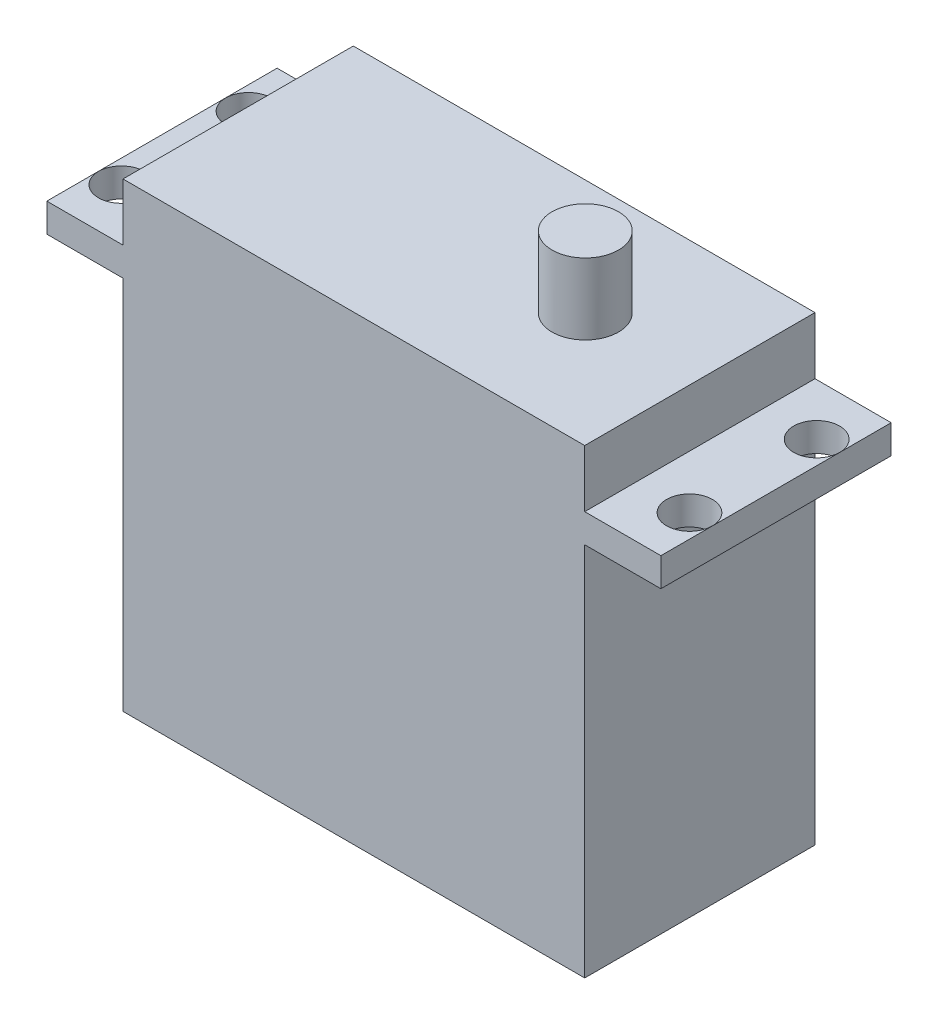
ISO-10303-21;
HEADER;
FILE_DESCRIPTION(('STEP AP214'),'2;1');
FILE_NAME('part.step','',(''),(''),'','','');
FILE_SCHEMA(('AUTOMOTIVE_DESIGN { 1 0 10303 214 1 1 1 1 }'));
ENDSEC;
DATA;
#1=APPLICATION_CONTEXT('core data for automotive mechanical design processes');
#2=APPLICATION_PROTOCOL_DEFINITION('international standard','automotive_design',2000,#1);
#3=PRODUCT_CONTEXT('',#1,'mechanical');
#4=PRODUCT('Part','Part','',(#3));
#5=PRODUCT_RELATED_PRODUCT_CATEGORY('part','',(#4));
#6=PRODUCT_DEFINITION_FORMATION('','',#4);
#7=PRODUCT_DEFINITION_CONTEXT('part definition',#1,'design');
#8=PRODUCT_DEFINITION('design','',#6,#7);
#9=PRODUCT_DEFINITION_SHAPE('','',#8);
#10=(LENGTH_UNIT() NAMED_UNIT(*) SI_UNIT(.MILLI.,.METRE.));
#11=(NAMED_UNIT(*) PLANE_ANGLE_UNIT() SI_UNIT($,.RADIAN.));
#12=(NAMED_UNIT(*) SI_UNIT($,.STERADIAN.) SOLID_ANGLE_UNIT());
#13=UNCERTAINTY_MEASURE_WITH_UNIT(LENGTH_MEASURE(1.E-05),#10,'distance_accuracy_value','');
#14=(GEOMETRIC_REPRESENTATION_CONTEXT(3) GLOBAL_UNCERTAINTY_ASSIGNED_CONTEXT((#13)) GLOBAL_UNIT_ASSIGNED_CONTEXT((#10,
#11,#12)) REPRESENTATION_CONTEXT('',''));
#15=CARTESIAN_POINT('',(0.,0.,0.));
#16=DIRECTION('',(0.,0.,1.));
#17=DIRECTION('',(1.,0.,0.));
#18=AXIS2_PLACEMENT_3D('',#15,#16,#17);
#19=CARTESIAN_POINT('',(20.15,40.25,10.05));
#20=DIRECTION('',(-1.,0.,0.));
#21=DIRECTION('',(0.,0.,1.));
#22=AXIS2_PLACEMENT_3D('',#19,#20,#21);
#23=PLANE('',#22);
#24=DIRECTION('',(0.,0.,-1.));
#25=VECTOR('',#24,1.);
#26=CARTESIAN_POINT('',(20.15,32.75,0.));
#27=LINE('',#26,#25);
#28=CARTESIAN_POINT('',(20.15,32.75,10.05));
#29=VERTEX_POINT('',#28);
#30=CARTESIAN_POINT('',(20.15,32.75,-10.05));
#31=VERTEX_POINT('',#30);
#32=EDGE_CURVE('E58',#29,#31,#27,.T.);
#33=ORIENTED_EDGE('',*,*,#32,.F.);
#34=DIRECTION('',(0.,-1.,0.));
#35=VECTOR('',#34,1.);
#36=CARTESIAN_POINT('',(20.15,40.25,10.05));
#37=LINE('',#36,#35);
#38=CARTESIAN_POINT('',(20.15,0.,10.05));
#39=VERTEX_POINT('',#38);
#40=EDGE_CURVE('E233',#29,#39,#37,.T.);
#41=ORIENTED_EDGE('',*,*,#40,.T.);
#42=DIRECTION('',(0.,0.,-1.));
#43=VECTOR('',#42,1.);
#44=CARTESIAN_POINT('',(20.15,0.,10.05));
#45=LINE('',#44,#43);
#46=CARTESIAN_POINT('',(20.15,0.,-10.05));
#47=VERTEX_POINT('',#46);
#48=EDGE_CURVE('E222',#39,#47,#45,.T.);
#49=ORIENTED_EDGE('',*,*,#48,.T.);
#50=DIRECTION('',(0.,-1.,0.));
#51=VECTOR('',#50,1.);
#52=CARTESIAN_POINT('',(20.15,40.25,-10.05));
#53=LINE('',#52,#51);
#54=EDGE_CURVE('E249',#31,#47,#53,.T.);
#55=ORIENTED_EDGE('',*,*,#54,.F.);
#56=EDGE_LOOP('',(#33,#41,#49,#55));
#57=FACE_BOUND('',#56,.T.);
#58=ADVANCED_FACE('F43',(#57),#23,.F.);
#59=CARTESIAN_POINT('',(-20.15,40.25,10.05));
#60=DIRECTION('',(1.,0.,0.));
#61=DIRECTION('',(0.,0.,-1.));
#62=AXIS2_PLACEMENT_3D('',#59,#60,#61);
#63=PLANE('',#62);
#64=DIRECTION('',(0.,0.,1.));
#65=VECTOR('',#64,1.);
#66=CARTESIAN_POINT('',(-20.15,32.75,0.));
#67=LINE('',#66,#65);
#68=CARTESIAN_POINT('',(-20.15,32.75,-10.05));
#69=VERTEX_POINT('',#68);
#70=CARTESIAN_POINT('',(-20.15,32.75,10.05));
#71=VERTEX_POINT('',#70);
#72=EDGE_CURVE('E141',#69,#71,#67,.T.);
#73=ORIENTED_EDGE('',*,*,#72,.F.);
#74=DIRECTION('',(0.,-1.,0.));
#75=VECTOR('',#74,1.);
#76=CARTESIAN_POINT('',(-20.15,40.25,-10.05));
#77=LINE('',#76,#75);
#78=CARTESIAN_POINT('',(-20.15,0.,-10.05));
#79=VERTEX_POINT('',#78);
#80=EDGE_CURVE('E247',#69,#79,#77,.T.);
#81=ORIENTED_EDGE('',*,*,#80,.T.);
#82=DIRECTION('',(0.,0.,1.));
#83=VECTOR('',#82,1.);
#84=CARTESIAN_POINT('',(-20.15,0.,10.05));
#85=LINE('',#84,#83);
#86=CARTESIAN_POINT('',(-20.15,0.,10.05));
#87=VERTEX_POINT('',#86);
#88=EDGE_CURVE('E239',#79,#87,#85,.T.);
#89=ORIENTED_EDGE('',*,*,#88,.T.);
#90=DIRECTION('',(0.,-1.,0.));
#91=VECTOR('',#90,1.);
#92=CARTESIAN_POINT('',(-20.15,40.25,10.05));
#93=LINE('',#92,#91);
#94=EDGE_CURVE('E244',#71,#87,#93,.T.);
#95=ORIENTED_EDGE('',*,*,#94,.F.);
#96=EDGE_LOOP('',(#73,#81,#89,#95));
#97=FACE_BOUND('',#96,.T.);
#98=ADVANCED_FACE('F266',(#97),#63,.F.);
#99=CARTESIAN_POINT('',(20.15,40.25,10.05));
#100=VERTEX_POINT('',#99);
#101=CARTESIAN_POINT('',(20.15,35.25,10.05));
#102=VERTEX_POINT('',#101);
#103=EDGE_CURVE('E66',#100,#102,#37,.T.);
#104=ORIENTED_EDGE('',*,*,#103,.T.);
#105=DIRECTION('',(0.,0.,-1.));
#106=VECTOR('',#105,1.);
#107=CARTESIAN_POINT('',(20.15,35.25,0.));
#108=LINE('',#107,#106);
#109=CARTESIAN_POINT('',(20.15,35.25,-10.05));
#110=VERTEX_POINT('',#109);
#111=EDGE_CURVE('E209',#102,#110,#108,.T.);
#112=ORIENTED_EDGE('',*,*,#111,.T.);
#113=CARTESIAN_POINT('',(20.15,40.25,-10.05));
#114=VERTEX_POINT('',#113);
#115=EDGE_CURVE('E51',#114,#110,#53,.T.);
#116=ORIENTED_EDGE('',*,*,#115,.F.);
#117=DIRECTION('',(0.,0.,-1.));
#118=VECTOR('',#117,1.);
#119=CARTESIAN_POINT('',(20.15,40.25,10.05));
#120=LINE('',#119,#118);
#121=EDGE_CURVE('E223',#100,#114,#120,.T.);
#122=ORIENTED_EDGE('',*,*,#121,.F.);
#123=EDGE_LOOP('',(#104,#112,#116,#122));
#124=FACE_BOUND('',#123,.T.);
#125=ADVANCED_FACE('F45',(#124),#23,.F.);
#126=CARTESIAN_POINT('',(-20.15,40.25,-10.05));
#127=DIRECTION('',(0.,0.,1.));
#128=DIRECTION('',(1.,0.,0.));
#129=AXIS2_PLACEMENT_3D('',#126,#127,#128);
#130=PLANE('',#129);
#131=DIRECTION('',(-1.,0.,0.));
#132=VECTOR('',#131,1.);
#133=CARTESIAN_POINT('',(-20.15,0.,-10.05));
#134=LINE('',#133,#132);
#135=EDGE_CURVE('E236',#47,#79,#134,.T.);
#136=ORIENTED_EDGE('',*,*,#135,.T.);
#137=ORIENTED_EDGE('',*,*,#80,.F.);
#138=DIRECTION('',(-1.,0.,0.));
#139=VECTOR('',#138,1.);
#140=CARTESIAN_POINT('',(0.,32.75,-10.05));
#141=LINE('',#140,#139);
#142=CARTESIAN_POINT('',(-26.8,32.75,-10.05));
#143=VERTEX_POINT('',#142);
#144=EDGE_CURVE('E166',#69,#143,#141,.T.);
#145=ORIENTED_EDGE('',*,*,#144,.T.);
#146=DIRECTION('',(0.,1.,0.));
#147=VECTOR('',#146,1.);
#148=CARTESIAN_POINT('',(-26.8,32.75,-10.05));
#149=LINE('',#148,#147);
#150=CARTESIAN_POINT('',(-26.8,35.25,-10.05));
#151=VERTEX_POINT('',#150);
#152=EDGE_CURVE('E154',#143,#151,#149,.T.);
#153=ORIENTED_EDGE('',*,*,#152,.T.);
#154=DIRECTION('',(-1.,0.,0.));
#155=VECTOR('',#154,1.);
#156=CARTESIAN_POINT('',(0.,35.25,-10.05));
#157=LINE('',#156,#155);
#158=CARTESIAN_POINT('',(-20.15,35.25,-10.05));
#159=VERTEX_POINT('',#158);
#160=EDGE_CURVE('E179',#159,#151,#157,.T.);
#161=ORIENTED_EDGE('',*,*,#160,.F.);
#162=CARTESIAN_POINT('',(-20.15,40.25,-10.05));
#163=VERTEX_POINT('',#162);
#164=EDGE_CURVE('E248',#163,#159,#77,.T.);
#165=ORIENTED_EDGE('',*,*,#164,.F.);
#166=DIRECTION('',(-1.,0.,0.));
#167=VECTOR('',#166,1.);
#168=CARTESIAN_POINT('',(-20.15,40.25,-10.05));
#169=LINE('',#168,#167);
#170=EDGE_CURVE('E226',#114,#163,#169,.T.);
#171=ORIENTED_EDGE('',*,*,#170,.F.);
#172=ORIENTED_EDGE('',*,*,#115,.T.);
#173=DIRECTION('',(1.,0.,0.));
#174=VECTOR('',#173,1.);
#175=CARTESIAN_POINT('',(0.,35.25,-10.05));
#176=LINE('',#175,#174);
#177=CARTESIAN_POINT('',(26.8,35.25,-10.05));
#178=VERTEX_POINT('',#177);
#179=EDGE_CURVE('E207',#110,#178,#176,.T.);
#180=ORIENTED_EDGE('',*,*,#179,.T.);
#181=DIRECTION('',(0.,1.,0.));
#182=VECTOR('',#181,1.);
#183=CARTESIAN_POINT('',(26.8,32.75,-10.05));
#184=LINE('',#183,#182);
#185=CARTESIAN_POINT('',(26.8,32.75,-10.05));
#186=VERTEX_POINT('',#185);
#187=EDGE_CURVE('E175',#186,#178,#184,.T.);
#188=ORIENTED_EDGE('',*,*,#187,.F.);
#189=DIRECTION('',(1.,0.,0.));
#190=VECTOR('',#189,1.);
#191=CARTESIAN_POINT('',(0.,32.75,-10.05));
#192=LINE('',#191,#190);
#193=EDGE_CURVE('E192',#31,#186,#192,.T.);
#194=ORIENTED_EDGE('',*,*,#193,.F.);
#195=ORIENTED_EDGE('',*,*,#54,.T.);
#196=EDGE_LOOP('',(#136,#137,#145,#153,#161,#165,#171,#172,#180,#188,#194,#195));
#197=FACE_BOUND('',#196,.T.);
#198=ADVANCED_FACE('F256',(#197),#130,.F.);
#199=ORIENTED_EDGE('',*,*,#164,.T.);
#200=DIRECTION('',(0.,0.,1.));
#201=VECTOR('',#200,1.);
#202=CARTESIAN_POINT('',(-20.15,35.25,0.));
#203=LINE('',#202,#201);
#204=CARTESIAN_POINT('',(-20.15,35.25,10.05));
#205=VERTEX_POINT('',#204);
#206=EDGE_CURVE('E177',#159,#205,#203,.T.);
#207=ORIENTED_EDGE('',*,*,#206,.T.);
#208=CARTESIAN_POINT('',(-20.15,40.25,10.05));
#209=VERTEX_POINT('',#208);
#210=EDGE_CURVE('E245',#209,#205,#93,.T.);
#211=ORIENTED_EDGE('',*,*,#210,.F.);
#212=DIRECTION('',(0.,0.,1.));
#213=VECTOR('',#212,1.);
#214=CARTESIAN_POINT('',(-20.15,40.25,10.05));
#215=LINE('',#214,#213);
#216=EDGE_CURVE('E229',#163,#209,#215,.T.);
#217=ORIENTED_EDGE('',*,*,#216,.F.);
#218=EDGE_LOOP('',(#199,#207,#211,#217));
#219=FACE_BOUND('',#218,.T.);
#220=ADVANCED_FACE('F275',(#219),#63,.F.);
#221=CARTESIAN_POINT('',(-20.15,40.25,10.05));
#222=DIRECTION('',(0.,0.,-1.));
#223=DIRECTION('',(-1.,0.,0.));
#224=AXIS2_PLACEMENT_3D('',#221,#222,#223);
#225=PLANE('',#224);
#226=DIRECTION('',(1.,0.,0.));
#227=VECTOR('',#226,1.);
#228=CARTESIAN_POINT('',(-20.15,0.,10.05));
#229=LINE('',#228,#227);
#230=EDGE_CURVE('E227',#87,#39,#229,.T.);
#231=ORIENTED_EDGE('',*,*,#230,.T.);
#232=ORIENTED_EDGE('',*,*,#40,.F.);
#233=DIRECTION('',(-1.,0.,0.));
#234=VECTOR('',#233,1.);
#235=CARTESIAN_POINT('',(0.,32.75,10.05));
#236=LINE('',#235,#234);
#237=CARTESIAN_POINT('',(26.8,32.75,10.05));
#238=VERTEX_POINT('',#237);
#239=EDGE_CURVE('E186',#238,#29,#236,.T.);
#240=ORIENTED_EDGE('',*,*,#239,.F.);
#241=DIRECTION('',(0.,1.,0.));
#242=VECTOR('',#241,1.);
#243=CARTESIAN_POINT('',(26.8,32.75,10.05));
#244=LINE('',#243,#242);
#245=CARTESIAN_POINT('',(26.8,35.25,10.05));
#246=VERTEX_POINT('',#245);
#247=EDGE_CURVE('E201',#238,#246,#244,.T.);
#248=ORIENTED_EDGE('',*,*,#247,.T.);
#249=DIRECTION('',(-1.,0.,0.));
#250=VECTOR('',#249,1.);
#251=CARTESIAN_POINT('',(0.,35.25,10.05));
#252=LINE('',#251,#250);
#253=EDGE_CURVE('E202',#246,#102,#252,.T.);
#254=ORIENTED_EDGE('',*,*,#253,.T.);
#255=ORIENTED_EDGE('',*,*,#103,.F.);
#256=DIRECTION('',(1.,0.,0.));
#257=VECTOR('',#256,1.);
#258=CARTESIAN_POINT('',(-20.15,40.25,10.05));
#259=LINE('',#258,#257);
#260=EDGE_CURVE('E231',#209,#100,#259,.T.);
#261=ORIENTED_EDGE('',*,*,#260,.F.);
#262=ORIENTED_EDGE('',*,*,#210,.T.);
#263=DIRECTION('',(-1.,0.,0.));
#264=VECTOR('',#263,1.);
#265=CARTESIAN_POINT('',(0.,35.25,10.05));
#266=LINE('',#265,#264);
#267=CARTESIAN_POINT('',(-26.8,35.25,10.05));
#268=VERTEX_POINT('',#267);
#269=EDGE_CURVE('E150',#205,#268,#266,.T.);
#270=ORIENTED_EDGE('',*,*,#269,.T.);
#271=DIRECTION('',(0.,1.,0.));
#272=VECTOR('',#271,1.);
#273=CARTESIAN_POINT('',(-26.8,32.75,10.05));
#274=LINE('',#273,#272);
#275=CARTESIAN_POINT('',(-26.8,32.75,10.05));
#276=VERTEX_POINT('',#275);
#277=EDGE_CURVE('E145',#276,#268,#274,.T.);
#278=ORIENTED_EDGE('',*,*,#277,.F.);
#279=DIRECTION('',(-1.,0.,0.));
#280=VECTOR('',#279,1.);
#281=CARTESIAN_POINT('',(0.,32.75,10.05));
#282=LINE('',#281,#280);
#283=EDGE_CURVE('E133',#71,#276,#282,.T.);
#284=ORIENTED_EDGE('',*,*,#283,.F.);
#285=ORIENTED_EDGE('',*,*,#94,.T.);
#286=EDGE_LOOP('',(#231,#232,#240,#248,#254,#255,#261,#262,#270,#278,#284,#285));
#287=FACE_BOUND('',#286,.T.);
#288=ADVANCED_FACE('F147',(#287),#225,.F.);
#289=CARTESIAN_POINT('',(0.,40.25,0.));
#290=DIRECTION('',(0.,-1.,0.));
#291=DIRECTION('',(0.,0.,-1.));
#292=AXIS2_PLACEMENT_3D('',#289,#290,#291);
#293=PLANE('',#292);
#294=CARTESIAN_POINT('',(10.15,40.25,0.));
#295=DIRECTION('',(0.,-1.,0.));
#296=DIRECTION('',(0.,0.,-1.));
#297=AXIS2_PLACEMENT_3D('',#294,#295,#296);
#298=CIRCLE('',#297,2.9);
#299=CARTESIAN_POINT('',(10.15,40.25,-2.9));
#300=VERTEX_POINT('',#299);
#301=EDGE_CURVE('E11',#300,#300,#298,.F.);
#302=ORIENTED_EDGE('',*,*,#301,.F.);
#303=EDGE_LOOP('',(#302));
#304=FACE_BOUND('',#303,.T.);
#305=ORIENTED_EDGE('',*,*,#121,.T.);
#306=ORIENTED_EDGE('',*,*,#170,.T.);
#307=ORIENTED_EDGE('',*,*,#216,.T.);
#308=ORIENTED_EDGE('',*,*,#260,.T.);
#309=EDGE_LOOP('',(#305,#306,#307,#308));
#310=FACE_BOUND('',#309,.T.);
#311=ADVANCED_FACE('F279',(#304,#310),#293,.F.);
#312=CARTESIAN_POINT('',(0.,0.,0.));
#313=DIRECTION('',(0.,-1.,0.));
#314=DIRECTION('',(0.,0.,-1.));
#315=AXIS2_PLACEMENT_3D('',#312,#313,#314);
#316=PLANE('',#315);
#317=ORIENTED_EDGE('',*,*,#48,.F.);
#318=ORIENTED_EDGE('',*,*,#230,.F.);
#319=ORIENTED_EDGE('',*,*,#88,.F.);
#320=ORIENTED_EDGE('',*,*,#135,.F.);
#321=EDGE_LOOP('',(#317,#318,#319,#320));
#322=FACE_BOUND('',#321,.T.);
#323=ADVANCED_FACE('F262',(#322),#316,.T.);
#324=CARTESIAN_POINT('',(10.15,46.45,0.));
#325=DIRECTION('',(0.,-1.,0.));
#326=DIRECTION('',(0.,0.,-1.));
#327=AXIS2_PLACEMENT_3D('',#324,#325,#326);
#328=CYLINDRICAL_SURFACE('',#327,2.9);
#329=CARTESIAN_POINT('',(10.15,46.45,0.));
#330=DIRECTION('',(0.,1.,0.));
#331=DIRECTION('',(0.,0.,1.));
#332=AXIS2_PLACEMENT_3D('',#329,#330,#331);
#333=CIRCLE('',#332,2.9);
#334=CARTESIAN_POINT('',(10.15,46.45,2.9));
#335=VERTEX_POINT('',#334);
#336=EDGE_CURVE('E184',#335,#335,#333,.T.);
#337=ORIENTED_EDGE('',*,*,#336,.F.);
#338=EDGE_LOOP('',(#337));
#339=FACE_BOUND('',#338,.T.);
#340=ORIENTED_EDGE('',*,*,#301,.T.);
#341=EDGE_LOOP('',(#340));
#342=FACE_BOUND('',#341,.T.);
#343=ADVANCED_FACE('F326',(#339,#342),#328,.T.);
#344=CARTESIAN_POINT('',(10.15,46.45,0.));
#345=DIRECTION('',(0.,1.,0.));
#346=DIRECTION('',(0.,0.,1.));
#347=AXIS2_PLACEMENT_3D('',#344,#345,#346);
#348=PLANE('',#347);
#349=ORIENTED_EDGE('',*,*,#336,.T.);
#350=EDGE_LOOP('',(#349));
#351=FACE_BOUND('',#350,.T.);
#352=ADVANCED_FACE('F332',(#351),#348,.T.);
#353=CARTESIAN_POINT('',(-26.8,32.75,0.));
#354=DIRECTION('',(1.,0.,0.));
#355=DIRECTION('',(0.,0.,-1.));
#356=AXIS2_PLACEMENT_3D('',#353,#354,#355);
#357=PLANE('',#356);
#358=DIRECTION('',(0.,0.,-1.));
#359=VECTOR('',#358,1.);
#360=CARTESIAN_POINT('',(-26.8,35.25,0.));
#361=LINE('',#360,#359);
#362=EDGE_CURVE('E173',#268,#151,#361,.T.);
#363=ORIENTED_EDGE('',*,*,#362,.T.);
#364=ORIENTED_EDGE('',*,*,#152,.F.);
#365=DIRECTION('',(0.,0.,-1.));
#366=VECTOR('',#365,1.);
#367=CARTESIAN_POINT('',(-26.8,32.75,0.));
#368=LINE('',#367,#366);
#369=EDGE_CURVE('E139',#276,#143,#368,.T.);
#370=ORIENTED_EDGE('',*,*,#369,.F.);
#371=ORIENTED_EDGE('',*,*,#277,.T.);
#372=EDGE_LOOP('',(#363,#364,#370,#371));
#373=FACE_BOUND('',#372,.T.);
#374=ADVANCED_FACE('F157',(#373),#357,.F.);
#375=CARTESIAN_POINT('',(-24.794421728717,32.75,-5.55));
#376=DIRECTION('',(0.,1.,0.));
#377=DIRECTION('',(0.,0.,1.));
#378=AXIS2_PLACEMENT_3D('',#375,#376,#377);
#379=CYLINDRICAL_SURFACE('',#378,2.);
#380=CARTESIAN_POINT('',(-24.794421728717,32.75,-5.55));
#381=DIRECTION('',(0.,1.,0.));
#382=DIRECTION('',(0.,0.,1.));
#383=AXIS2_PLACEMENT_3D('',#380,#381,#382);
#384=CIRCLE('',#383,2.);
#385=CARTESIAN_POINT('',(-24.794421728717,32.75,-3.55));
#386=VERTEX_POINT('',#385);
#387=EDGE_CURVE('E168',#386,#386,#384,.T.);
#388=ORIENTED_EDGE('',*,*,#387,.F.);
#389=EDGE_LOOP('',(#388));
#390=FACE_BOUND('',#389,.T.);
#391=CARTESIAN_POINT('',(-24.794421728717,35.25,-5.55));
#392=DIRECTION('',(0.,1.,0.));
#393=DIRECTION('',(0.,0.,1.));
#394=AXIS2_PLACEMENT_3D('',#391,#392,#393);
#395=CIRCLE('',#394,2.);
#396=CARTESIAN_POINT('',(-24.794421728717,35.25,-3.55));
#397=VERTEX_POINT('',#396);
#398=EDGE_CURVE('E162',#397,#397,#395,.T.);
#399=ORIENTED_EDGE('',*,*,#398,.T.);
#400=EDGE_LOOP('',(#399));
#401=FACE_BOUND('',#400,.T.);
#402=ADVANCED_FACE('F355',(#390,#401),#379,.F.);
#403=CARTESIAN_POINT('',(-24.794421728717,32.75,5.55));
#404=DIRECTION('',(0.,1.,0.));
#405=DIRECTION('',(0.,0.,1.));
#406=AXIS2_PLACEMENT_3D('',#403,#404,#405);
#407=CYLINDRICAL_SURFACE('',#406,2.);
#408=CARTESIAN_POINT('',(-24.794421728717,32.75,5.55));
#409=DIRECTION('',(0.,1.,0.));
#410=DIRECTION('',(0.,0.,1.));
#411=AXIS2_PLACEMENT_3D('',#408,#409,#410);
#412=CIRCLE('',#411,2.);
#413=CARTESIAN_POINT('',(-24.794421728717,32.75,7.55));
#414=VERTEX_POINT('',#413);
#415=EDGE_CURVE('E155',#414,#414,#412,.F.);
#416=ORIENTED_EDGE('',*,*,#415,.T.);
#417=EDGE_LOOP('',(#416));
#418=FACE_BOUND('',#417,.T.);
#419=CARTESIAN_POINT('',(-24.794421728717,35.25,5.55));
#420=DIRECTION('',(0.,1.,0.));
#421=DIRECTION('',(0.,0.,1.));
#422=AXIS2_PLACEMENT_3D('',#419,#420,#421);
#423=CIRCLE('',#422,2.);
#424=CARTESIAN_POINT('',(-24.794421728717,35.25,7.55));
#425=VERTEX_POINT('',#424);
#426=EDGE_CURVE('E159',#425,#425,#423,.F.);
#427=ORIENTED_EDGE('',*,*,#426,.F.);
#428=EDGE_LOOP('',(#427));
#429=FACE_BOUND('',#428,.T.);
#430=ADVANCED_FACE('F350',(#418,#429),#407,.F.);
#431=CARTESIAN_POINT('',(0.,32.75,0.));
#432=DIRECTION('',(0.,1.,0.));
#433=DIRECTION('',(0.,0.,1.));
#434=AXIS2_PLACEMENT_3D('',#431,#432,#433);
#435=PLANE('',#434);
#436=ORIENTED_EDGE('',*,*,#369,.T.);
#437=ORIENTED_EDGE('',*,*,#144,.F.);
#438=ORIENTED_EDGE('',*,*,#72,.T.);
#439=ORIENTED_EDGE('',*,*,#283,.T.);
#440=EDGE_LOOP('',(#436,#437,#438,#439));
#441=FACE_BOUND('',#440,.T.);
#442=ORIENTED_EDGE('',*,*,#387,.T.);
#443=EDGE_LOOP('',(#442));
#444=FACE_BOUND('',#443,.T.);
#445=ORIENTED_EDGE('',*,*,#415,.F.);
#446=EDGE_LOOP('',(#445));
#447=FACE_BOUND('',#446,.T.);
#448=ADVANCED_FACE('F135',(#441,#444,#447),#435,.F.);
#449=CARTESIAN_POINT('',(0.,35.25,0.));
#450=DIRECTION('',(0.,1.,0.));
#451=DIRECTION('',(0.,0.,1.));
#452=AXIS2_PLACEMENT_3D('',#449,#450,#451);
#453=PLANE('',#452);
#454=ORIENTED_EDGE('',*,*,#362,.F.);
#455=ORIENTED_EDGE('',*,*,#269,.F.);
#456=ORIENTED_EDGE('',*,*,#206,.F.);
#457=ORIENTED_EDGE('',*,*,#160,.T.);
#458=EDGE_LOOP('',(#454,#455,#456,#457));
#459=FACE_BOUND('',#458,.T.);
#460=ORIENTED_EDGE('',*,*,#398,.F.);
#461=EDGE_LOOP('',(#460));
#462=FACE_BOUND('',#461,.T.);
#463=ORIENTED_EDGE('',*,*,#426,.T.);
#464=EDGE_LOOP('',(#463));
#465=FACE_BOUND('',#464,.T.);
#466=ADVANCED_FACE('F271',(#459,#462,#465),#453,.T.);
#467=CARTESIAN_POINT('',(24.794421728717,32.75,5.55));
#468=DIRECTION('',(0.,1.,0.));
#469=DIRECTION('',(0.,0.,1.));
#470=AXIS2_PLACEMENT_3D('',#467,#468,#469);
#471=CYLINDRICAL_SURFACE('',#470,2.);
#472=CARTESIAN_POINT('',(24.794421728717,32.75,5.55));
#473=DIRECTION('',(0.,1.,0.));
#474=DIRECTION('',(0.,0.,1.));
#475=AXIS2_PLACEMENT_3D('',#472,#473,#474);
#476=CIRCLE('',#475,2.);
#477=CARTESIAN_POINT('',(24.794421728717,32.75,7.55));
#478=VERTEX_POINT('',#477);
#479=EDGE_CURVE('E195',#478,#478,#476,.T.);
#480=ORIENTED_EDGE('',*,*,#479,.F.);
#481=EDGE_LOOP('',(#480));
#482=FACE_BOUND('',#481,.T.);
#483=CARTESIAN_POINT('',(24.794421728717,35.25,5.55));
#484=DIRECTION('',(0.,1.,0.));
#485=DIRECTION('',(0.,0.,1.));
#486=AXIS2_PLACEMENT_3D('',#483,#484,#485);
#487=CIRCLE('',#486,2.);
#488=CARTESIAN_POINT('',(24.794421728717,35.25,7.55));
#489=VERTEX_POINT('',#488);
#490=EDGE_CURVE('E211',#489,#489,#487,.T.);
#491=ORIENTED_EDGE('',*,*,#490,.T.);
#492=EDGE_LOOP('',(#491));
#493=FACE_BOUND('',#492,.T.);
#494=ADVANCED_FACE('F338',(#482,#493),#471,.F.);
#495=CARTESIAN_POINT('',(26.8,32.75,0.));
#496=DIRECTION('',(-1.,0.,0.));
#497=DIRECTION('',(0.,0.,1.));
#498=AXIS2_PLACEMENT_3D('',#495,#496,#497);
#499=PLANE('',#498);
#500=DIRECTION('',(0.,0.,1.));
#501=VECTOR('',#500,1.);
#502=CARTESIAN_POINT('',(26.8,35.25,0.));
#503=LINE('',#502,#501);
#504=EDGE_CURVE('E205',#178,#246,#503,.T.);
#505=ORIENTED_EDGE('',*,*,#504,.T.);
#506=ORIENTED_EDGE('',*,*,#247,.F.);
#507=DIRECTION('',(0.,0.,1.));
#508=VECTOR('',#507,1.);
#509=CARTESIAN_POINT('',(26.8,32.75,0.));
#510=LINE('',#509,#508);
#511=EDGE_CURVE('E189',#186,#238,#510,.T.);
#512=ORIENTED_EDGE('',*,*,#511,.F.);
#513=ORIENTED_EDGE('',*,*,#187,.T.);
#514=EDGE_LOOP('',(#505,#506,#512,#513));
#515=FACE_BOUND('',#514,.T.);
#516=ADVANCED_FACE('F288',(#515),#499,.F.);
#517=CARTESIAN_POINT('',(24.794421728717,32.75,-5.55));
#518=DIRECTION('',(0.,1.,0.));
#519=DIRECTION('',(0.,0.,1.));
#520=AXIS2_PLACEMENT_3D('',#517,#518,#519);
#521=CYLINDRICAL_SURFACE('',#520,2.);
#522=CARTESIAN_POINT('',(24.794421728717,32.75,-5.55));
#523=DIRECTION('',(0.,1.,0.));
#524=DIRECTION('',(0.,0.,1.));
#525=AXIS2_PLACEMENT_3D('',#522,#523,#524);
#526=CIRCLE('',#525,2.);
#527=CARTESIAN_POINT('',(24.794421728717,32.75,-3.55));
#528=VERTEX_POINT('',#527);
#529=EDGE_CURVE('E198',#528,#528,#526,.F.);
#530=ORIENTED_EDGE('',*,*,#529,.T.);
#531=EDGE_LOOP('',(#530));
#532=FACE_BOUND('',#531,.T.);
#533=CARTESIAN_POINT('',(24.794421728717,35.25,-5.55));
#534=DIRECTION('',(0.,1.,0.));
#535=DIRECTION('',(0.,0.,1.));
#536=AXIS2_PLACEMENT_3D('',#533,#534,#535);
#537=CIRCLE('',#536,2.);
#538=CARTESIAN_POINT('',(24.794421728717,35.25,-3.55));
#539=VERTEX_POINT('',#538);
#540=EDGE_CURVE('E190',#539,#539,#537,.F.);
#541=ORIENTED_EDGE('',*,*,#540,.F.);
#542=EDGE_LOOP('',(#541));
#543=FACE_BOUND('',#542,.T.);
#544=ADVANCED_FACE('F293',(#532,#543),#521,.F.);
#545=CARTESIAN_POINT('',(0.,32.75,0.));
#546=DIRECTION('',(0.,1.,0.));
#547=DIRECTION('',(0.,0.,1.));
#548=AXIS2_PLACEMENT_3D('',#545,#546,#547);
#549=PLANE('',#548);
#550=ORIENTED_EDGE('',*,*,#239,.T.);
#551=ORIENTED_EDGE('',*,*,#32,.T.);
#552=ORIENTED_EDGE('',*,*,#193,.T.);
#553=ORIENTED_EDGE('',*,*,#511,.T.);
#554=EDGE_LOOP('',(#550,#551,#552,#553));
#555=FACE_BOUND('',#554,.T.);
#556=ORIENTED_EDGE('',*,*,#479,.T.);
#557=EDGE_LOOP('',(#556));
#558=FACE_BOUND('',#557,.T.);
#559=ORIENTED_EDGE('',*,*,#529,.F.);
#560=EDGE_LOOP('',(#559));
#561=FACE_BOUND('',#560,.T.);
#562=ADVANCED_FACE('F290',(#555,#558,#561),#549,.F.);
#563=CARTESIAN_POINT('',(0.,35.25,0.));
#564=DIRECTION('',(0.,1.,0.));
#565=DIRECTION('',(0.,0.,1.));
#566=AXIS2_PLACEMENT_3D('',#563,#564,#565);
#567=PLANE('',#566);
#568=ORIENTED_EDGE('',*,*,#253,.F.);
#569=ORIENTED_EDGE('',*,*,#504,.F.);
#570=ORIENTED_EDGE('',*,*,#179,.F.);
#571=ORIENTED_EDGE('',*,*,#111,.F.);
#572=EDGE_LOOP('',(#568,#569,#570,#571));
#573=FACE_BOUND('',#572,.T.);
#574=ORIENTED_EDGE('',*,*,#490,.F.);
#575=EDGE_LOOP('',(#574));
#576=FACE_BOUND('',#575,.T.);
#577=ORIENTED_EDGE('',*,*,#540,.T.);
#578=EDGE_LOOP('',(#577));
#579=FACE_BOUND('',#578,.T.);
#580=ADVANCED_FACE('F282',(#573,#576,#579),#567,.T.);
#581=CLOSED_SHELL('',(#58,#98,#125,#198,#220,#288,#311,#323,#343,#352,#374,#402,#430,#448,#466,
#494,#516,#544,#562,#580));
#582=MANIFOLD_SOLID_BREP('B2',#581);
#583=ADVANCED_BREP_SHAPE_REPRESENTATION('',(#18,#582),#14);
#584=SHAPE_DEFINITION_REPRESENTATION(#9,#583);
ENDSEC;
END-ISO-10303-21;
